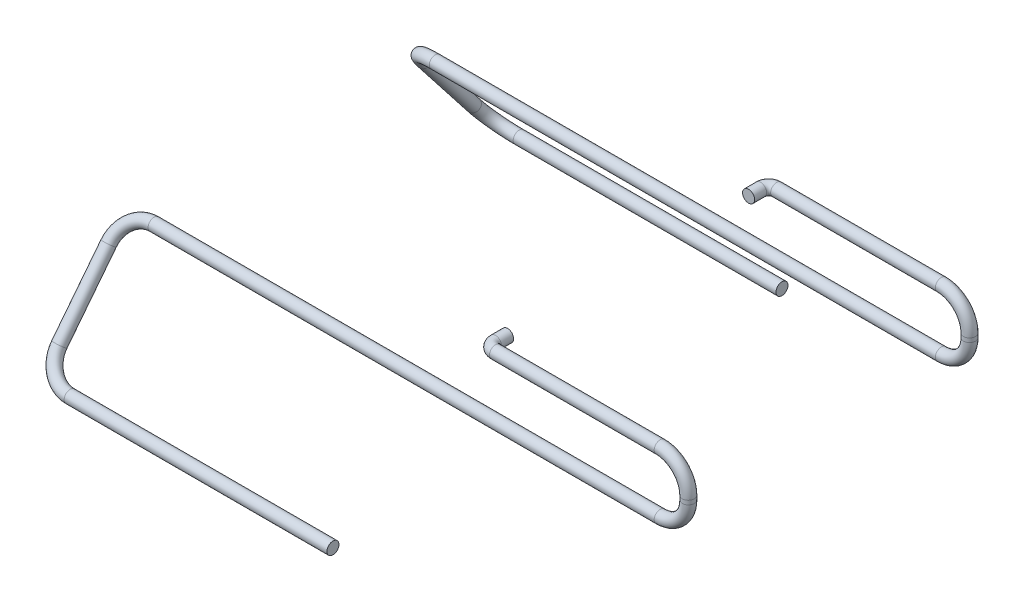
ISO-10303-21;
HEADER;
FILE_DESCRIPTION(('STEP AP214'),'2;1');
FILE_NAME('part.step','',(''),(''),'','','');
FILE_SCHEMA(('AUTOMOTIVE_DESIGN { 1 0 10303 214 1 1 1 1 }'));
ENDSEC;
DATA;
#1=APPLICATION_CONTEXT('core data for automotive mechanical design processes');
#2=APPLICATION_PROTOCOL_DEFINITION('international standard','automotive_design',2000,#1);
#3=PRODUCT_CONTEXT('',#1,'mechanical');
#4=PRODUCT('Part','Part','',(#3));
#5=PRODUCT_RELATED_PRODUCT_CATEGORY('part','',(#4));
#6=PRODUCT_DEFINITION_FORMATION('','',#4);
#7=PRODUCT_DEFINITION_CONTEXT('part definition',#1,'design');
#8=PRODUCT_DEFINITION('design','',#6,#7);
#9=PRODUCT_DEFINITION_SHAPE('','',#8);
#10=(LENGTH_UNIT() NAMED_UNIT(*) SI_UNIT(.MILLI.,.METRE.));
#11=(NAMED_UNIT(*) PLANE_ANGLE_UNIT() SI_UNIT($,.RADIAN.));
#12=(NAMED_UNIT(*) SI_UNIT($,.STERADIAN.) SOLID_ANGLE_UNIT());
#13=UNCERTAINTY_MEASURE_WITH_UNIT(LENGTH_MEASURE(1.E-05),#10,'distance_accuracy_value','');
#14=(GEOMETRIC_REPRESENTATION_CONTEXT(3) GLOBAL_UNCERTAINTY_ASSIGNED_CONTEXT((#13)) GLOBAL_UNIT_ASSIGNED_CONTEXT((#10,
#11,#12)) REPRESENTATION_CONTEXT('',''));
#15=CARTESIAN_POINT('',(0.,0.,0.));
#16=DIRECTION('',(0.,0.,1.));
#17=DIRECTION('',(1.,0.,0.));
#18=AXIS2_PLACEMENT_3D('',#15,#16,#17);
#19=CARTESIAN_POINT('',(-270.,0.,-650.));
#20=DIRECTION('',(1.,0.,0.));
#21=DIRECTION('',(0.,1.,0.));
#22=AXIS2_PLACEMENT_3D('',#19,#20,#21);
#23=CYLINDRICAL_SURFACE('',#22,15.0000000000001);
#24=CARTESIAN_POINT('',(-40.,0.,-650.));
#25=DIRECTION('',(1.,0.,0.));
#26=DIRECTION('',(0.,0.,1.));
#27=AXIS2_PLACEMENT_3D('',#24,#25,#26);
#28=CIRCLE('',#27,15.0000000000001);
#29=CARTESIAN_POINT('',(-40.,15.0000000000002,-650.));
#30=VERTEX_POINT('',#29);
#31=EDGE_CURVE('E58',#30,#30,#28,.T.);
#32=ORIENTED_EDGE('',*,*,#31,.F.);
#33=EDGE_LOOP('',(#32));
#34=FACE_BOUND('',#33,.T.);
#35=CARTESIAN_POINT('',(-450.,0.,-650.));
#36=DIRECTION('',(-1.,0.,0.));
#37=DIRECTION('',(0.,0.,1.));
#38=AXIS2_PLACEMENT_3D('',#35,#36,#37);
#39=CIRCLE('',#38,15.0000000000001);
#40=CARTESIAN_POINT('',(-450.,0.,-665.000000000001));
#41=VERTEX_POINT('',#40);
#42=EDGE_CURVE('E84',#41,#41,#39,.T.);
#43=ORIENTED_EDGE('',*,*,#42,.F.);
#44=EDGE_LOOP('',(#43));
#45=FACE_BOUND('',#44,.T.);
#46=ADVANCED_FACE('F43',(#34,#45),#23,.T.);
#47=CARTESIAN_POINT('',(-40.,-70.,-650.));
#48=DIRECTION('',(0.,0.,-1.));
#49=DIRECTION('',(-1.,0.,0.));
#50=AXIS2_PLACEMENT_3D('',#47,#48,#49);
#51=TOROIDAL_SURFACE('',#50,70.,15.0000000000001);
#52=CARTESIAN_POINT('',(29.9999999999999,-70.,-650.));
#53=DIRECTION('',(0.,-1.,0.));
#54=DIRECTION('',(0.,0.,1.));
#55=AXIS2_PLACEMENT_3D('',#52,#53,#54);
#56=CIRCLE('',#55,15.0000000000001);
#57=CARTESIAN_POINT('',(45.0000000000001,-70.,-650.));
#58=VERTEX_POINT('',#57);
#59=EDGE_CURVE('E54',#58,#58,#56,.T.);
#60=CARTESIAN_POINT('',(-40.,-70.,-650.));
#61=DIRECTION('',(0.,0.,-1.));
#62=DIRECTION('',(-1.,0.,0.));
#63=AXIS2_PLACEMENT_3D('',#60,#61,#62);
#64=CIRCLE('',#63,85.0000000000001);
#65=EDGE_CURVE('',#30,#58,#64,.T.);
#66=ORIENTED_EDGE('',*,*,#31,.T.);
#67=ORIENTED_EDGE('',*,*,#59,.F.);
#68=ORIENTED_EDGE('',*,*,#65,.T.);
#69=ORIENTED_EDGE('',*,*,#65,.F.);
#70=EDGE_LOOP('',(#66,#68,#67,#69));
#71=FACE_BOUND('',#70,.T.);
#72=ADVANCED_FACE('F91',(#71),#51,.T.);
#73=CARTESIAN_POINT('',(30.,-70.,-650.));
#74=DIRECTION('',(0.,-1.,0.));
#75=DIRECTION('',(1.,0.,0.));
#76=AXIS2_PLACEMENT_3D('',#73,#74,#75);
#77=CYLINDRICAL_SURFACE('',#76,15.0000000000001);
#78=CARTESIAN_POINT('',(30.,-80.,-650.));
#79=DIRECTION('',(0.,-1.,0.));
#80=DIRECTION('',(0.,0.,1.));
#81=AXIS2_PLACEMENT_3D('',#78,#79,#80);
#82=CIRCLE('',#81,15.0000000000001);
#83=CARTESIAN_POINT('',(45.0000000000001,-80.,-650.));
#84=VERTEX_POINT('',#83);
#85=EDGE_CURVE('E50',#84,#84,#82,.T.);
#86=ORIENTED_EDGE('',*,*,#85,.F.);
#87=EDGE_LOOP('',(#86));
#88=FACE_BOUND('',#87,.T.);
#89=ORIENTED_EDGE('',*,*,#59,.T.);
#90=EDGE_LOOP('',(#89));
#91=FACE_BOUND('',#90,.T.);
#92=ADVANCED_FACE('F98',(#88,#91),#77,.T.);
#93=CARTESIAN_POINT('',(-40.,-80.,-650.));
#94=DIRECTION('',(0.,0.,-1.));
#95=DIRECTION('',(-1.,0.,0.));
#96=AXIS2_PLACEMENT_3D('',#93,#94,#95);
#97=TOROIDAL_SURFACE('',#96,70.,15.0000000000001);
#98=CARTESIAN_POINT('',(-40.,-150.,-650.));
#99=DIRECTION('',(-1.,0.,0.));
#100=DIRECTION('',(0.,0.,1.));
#101=AXIS2_PLACEMENT_3D('',#98,#99,#100);
#102=CIRCLE('',#101,15.0000000000001);
#103=CARTESIAN_POINT('',(-40.,-165.,-650.));
#104=VERTEX_POINT('',#103);
#105=EDGE_CURVE('E12',#104,#104,#102,.T.);
#106=CARTESIAN_POINT('',(-40.,-80.,-650.));
#107=DIRECTION('',(0.,0.,-1.));
#108=DIRECTION('',(-1.,0.,0.));
#109=AXIS2_PLACEMENT_3D('',#106,#107,#108);
#110=CIRCLE('',#109,85.0000000000001);
#111=EDGE_CURVE('',#84,#104,#110,.T.);
#112=ORIENTED_EDGE('',*,*,#85,.T.);
#113=ORIENTED_EDGE('',*,*,#105,.F.);
#114=ORIENTED_EDGE('',*,*,#111,.T.);
#115=ORIENTED_EDGE('',*,*,#111,.F.);
#116=EDGE_LOOP('',(#112,#114,#113,#115));
#117=FACE_BOUND('',#116,.T.);
#118=ADVANCED_FACE('F109',(#117),#97,.T.);
#119=CARTESIAN_POINT('',(-40.,-150.,-650.));
#120=DIRECTION('',(-1.,0.,0.));
#121=DIRECTION('',(0.,-1.,0.));
#122=AXIS2_PLACEMENT_3D('',#119,#120,#121);
#123=CYLINDRICAL_SURFACE('',#122,15.0000000000001);
#124=ORIENTED_EDGE('',*,*,#105,.T.);
#125=EDGE_LOOP('',(#124));
#126=FACE_BOUND('',#125,.T.);
#127=CARTESIAN_POINT('',(-1300.,-150.,-650.));
#128=DIRECTION('',(-1.,0.,0.));
#129=DIRECTION('',(0.,-1.,0.));
#130=AXIS2_PLACEMENT_3D('',#127,#128,#129);
#131=CIRCLE('',#130,15.0000000000001);
#132=CARTESIAN_POINT('',(-1300.,-138.191801583891,-640.749786479988));
#133=VERTEX_POINT('',#132);
#134=EDGE_CURVE('E63',#133,#133,#131,.T.);
#135=ORIENTED_EDGE('',*,*,#134,.F.);
#136=EDGE_LOOP('',(#135));
#137=FACE_BOUND('',#136,.T.);
#138=ADVANCED_FACE('F45',(#126,#137),#123,.T.);
#139=CARTESIAN_POINT('',(-1120.,-416.8,-859.00368372643));
#140=DIRECTION('',(-1.,0.,0.));
#141=DIRECTION('',(0.,-1.,0.));
#142=AXIS2_PLACEMENT_3D('',#139,#140,#141);
#143=CYLINDRICAL_SURFACE('',#142,15.0000000000001);
#144=CARTESIAN_POINT('',(-1300.,-416.8,-859.00368372643));
#145=DIRECTION('',(1.,0.,0.));
#146=DIRECTION('',(0.,0.239409331859415,0.970918725650416));
#147=AXIS2_PLACEMENT_3D('',#144,#145,#146);
#148=CIRCLE('',#147,15.0000000000001);
#149=CARTESIAN_POINT('',(-1300.,-428.608198416109,-868.253897246443));
#150=VERTEX_POINT('',#149);
#151=EDGE_CURVE('E72',#150,#150,#148,.T.);
#152=ORIENTED_EDGE('',*,*,#151,.T.);
#153=EDGE_LOOP('',(#152));
#154=FACE_BOUND('',#153,.T.);
#155=CARTESIAN_POINT('',(-645.8,-416.8,-859.00368372643));
#156=DIRECTION('',(-1.,0.,0.));
#157=DIRECTION('',(0.,0.,-1.));
#158=AXIS2_PLACEMENT_3D('',#155,#156,#157);
#159=CIRCLE('',#158,15.);
#160=CARTESIAN_POINT('',(-645.8,-416.8,-874.00368372643));
#161=VERTEX_POINT('',#160);
#162=EDGE_CURVE('E75',#161,#161,#159,.T.);
#163=ORIENTED_EDGE('',*,*,#162,.T.);
#164=EDGE_LOOP('',(#163));
#165=FACE_BOUND('',#164,.T.);
#166=ADVANCED_FACE('F108',(#154,#165),#143,.T.);
#167=CARTESIAN_POINT('',(-1300.,-361.695074058161,-815.83602063304));
#168=DIRECTION('',(0.,0.616680901334144,-0.787213227740558));
#169=DIRECTION('',(0.,0.787213227740558,0.616680901334144));
#170=AXIS2_PLACEMENT_3D('',#167,#168,#169);
#171=TOROIDAL_SURFACE('',#170,70.0000000000002,15.0000000000001);
#172=CARTESIAN_POINT('',(-1370.,-361.695074058161,-815.83602063304));
#173=DIRECTION('',(0.,-0.787213227740558,-0.616680901334144));
#174=DIRECTION('',(0.787213227740558,-0.380295334070298,0.485459362825204));
#175=AXIS2_PLACEMENT_3D('',#172,#173,#174);
#176=CIRCLE('',#175,15.0000000000001);
#177=CARTESIAN_POINT('',(-1385.,-361.695074058161,-815.83602063304));
#178=VERTEX_POINT('',#177);
#179=EDGE_CURVE('E69',#178,#178,#176,.T.);
#180=CARTESIAN_POINT('',(-1300.,-361.695074058161,-815.83602063304));
#181=DIRECTION('',(0.,0.616680901334144,-0.787213227740558));
#182=DIRECTION('',(0.,0.787213227740558,0.616680901334144));
#183=AXIS2_PLACEMENT_3D('',#180,#181,#182);
#184=CIRCLE('',#183,85.0000000000003);
#185=EDGE_CURVE('',#150,#178,#184,.T.);
#186=ORIENTED_EDGE('',*,*,#151,.F.);
#187=ORIENTED_EDGE('',*,*,#179,.T.);
#188=ORIENTED_EDGE('',*,*,#185,.T.);
#189=ORIENTED_EDGE('',*,*,#185,.F.);
#190=EDGE_LOOP('',(#186,#188,#187,#189));
#191=FACE_BOUND('',#190,.T.);
#192=ADVANCED_FACE('F114',(#191),#171,.T.);
#193=CARTESIAN_POINT('',(-1370.,-361.695074058161,-815.83602063304));
#194=DIRECTION('',(0.,0.787213227740558,0.616680901334144));
#195=DIRECTION('',(0.,-0.616680901334144,0.787213227740558));
#196=AXIS2_PLACEMENT_3D('',#193,#194,#195);
#197=CYLINDRICAL_SURFACE('',#196,15.0000000000001);
#198=CARTESIAN_POINT('',(-1370.,-205.10492594184,-693.167663093391));
#199=DIRECTION('',(0.,-0.787213227740558,-0.616680901334144));
#200=DIRECTION('',(0.787213227740558,-0.380295334070292,0.485459362825208));
#201=AXIS2_PLACEMENT_3D('',#198,#199,#200);
#202=CIRCLE('',#201,15.0000000000001);
#203=CARTESIAN_POINT('',(-1385.,-205.10492594184,-693.167663093391));
#204=VERTEX_POINT('',#203);
#205=EDGE_CURVE('E66',#204,#204,#202,.T.);
#206=ORIENTED_EDGE('',*,*,#205,.T.);
#207=EDGE_LOOP('',(#206));
#208=FACE_BOUND('',#207,.T.);
#209=ORIENTED_EDGE('',*,*,#179,.F.);
#210=EDGE_LOOP('',(#209));
#211=FACE_BOUND('',#210,.T.);
#212=ADVANCED_FACE('F105',(#208,#211),#197,.T.);
#213=CARTESIAN_POINT('',(-1300.,-205.104925941839,-693.167663093391));
#214=DIRECTION('',(0.,0.616680901334144,-0.787213227740558));
#215=DIRECTION('',(0.,0.787213227740558,0.616680901334144));
#216=AXIS2_PLACEMENT_3D('',#213,#214,#215);
#217=TOROIDAL_SURFACE('',#216,70.0000000000001,15.0000000000001);
#218=CARTESIAN_POINT('',(-1300.,-205.104925941839,-693.167663093391));
#219=DIRECTION('',(0.,0.616680901334144,-0.787213227740558));
#220=DIRECTION('',(0.,0.787213227740558,0.616680901334144));
#221=AXIS2_PLACEMENT_3D('',#218,#219,#220);
#222=CIRCLE('',#221,85.0000000000002);
#223=EDGE_CURVE('',#204,#133,#222,.T.);
#224=ORIENTED_EDGE('',*,*,#205,.F.);
#225=ORIENTED_EDGE('',*,*,#134,.T.);
#226=ORIENTED_EDGE('',*,*,#223,.T.);
#227=ORIENTED_EDGE('',*,*,#223,.F.);
#228=EDGE_LOOP('',(#224,#226,#225,#227));
#229=FACE_BOUND('',#228,.T.);
#230=ADVANCED_FACE('F94',(#229),#217,.T.);
#231=CARTESIAN_POINT('',(-645.8,-416.8,-859.00368372643));
#232=DIRECTION('',(1.,0.,0.));
#233=DIRECTION('',(0.,0.,-1.));
#234=AXIS2_PLACEMENT_3D('',#231,#232,#233);
#235=PLANE('',#234);
#236=ORIENTED_EDGE('',*,*,#162,.F.);
#237=EDGE_LOOP('',(#236));
#238=FACE_BOUND('',#237,.T.);
#239=ADVANCED_FACE('F104',(#238),#235,.T.);
#240=CARTESIAN_POINT('',(-470.,0.,-600.));
#241=DIRECTION('',(0.,0.,1.));
#242=DIRECTION('',(1.,0.,0.));
#243=AXIS2_PLACEMENT_3D('',#240,#241,#242);
#244=PLANE('',#243);
#245=CARTESIAN_POINT('',(-470.,0.,-600.));
#246=DIRECTION('',(0.,0.,1.));
#247=DIRECTION('',(1.,0.,0.));
#248=AXIS2_PLACEMENT_3D('',#245,#246,#247);
#249=CIRCLE('',#248,15.0000000000001);
#250=CARTESIAN_POINT('',(-455.,0.,-600.));
#251=VERTEX_POINT('',#250);
#252=EDGE_CURVE('E78',#251,#251,#249,.T.);
#253=ORIENTED_EDGE('',*,*,#252,.T.);
#254=EDGE_LOOP('',(#253));
#255=FACE_BOUND('',#254,.T.);
#256=ADVANCED_FACE('F136',(#255),#244,.T.);
#257=CARTESIAN_POINT('',(-450.,0.,-630.));
#258=DIRECTION('',(0.,1.,0.));
#259=DIRECTION('',(-1.,0.,0.));
#260=AXIS2_PLACEMENT_3D('',#257,#258,#259);
#261=TOROIDAL_SURFACE('',#260,20.0000000000004,15.0000000000001);
#262=CARTESIAN_POINT('',(-470.,0.,-630.000000000001));
#263=DIRECTION('',(0.,0.,1.));
#264=DIRECTION('',(1.,0.,0.));
#265=AXIS2_PLACEMENT_3D('',#262,#263,#264);
#266=CIRCLE('',#265,15.0000000000001);
#267=CARTESIAN_POINT('',(-485.,0.,-630.000000000001));
#268=VERTEX_POINT('',#267);
#269=EDGE_CURVE('E81',#268,#268,#266,.T.);
#270=CARTESIAN_POINT('',(-450.,0.,-630.));
#271=DIRECTION('',(0.,1.,0.));
#272=DIRECTION('',(-1.,0.,0.));
#273=AXIS2_PLACEMENT_3D('',#270,#271,#272);
#274=CIRCLE('',#273,35.0000000000005);
#275=EDGE_CURVE('',#41,#268,#274,.T.);
#276=ORIENTED_EDGE('',*,*,#42,.T.);
#277=ORIENTED_EDGE('',*,*,#269,.F.);
#278=ORIENTED_EDGE('',*,*,#275,.T.);
#279=ORIENTED_EDGE('',*,*,#275,.F.);
#280=EDGE_LOOP('',(#276,#278,#277,#279));
#281=FACE_BOUND('',#280,.T.);
#282=ADVANCED_FACE('F88',(#281),#261,.T.);
#283=CARTESIAN_POINT('',(-470.,0.,-630.000000000001));
#284=DIRECTION('',(0.,0.,1.));
#285=DIRECTION('',(1.,0.,0.));
#286=AXIS2_PLACEMENT_3D('',#283,#284,#285);
#287=CYLINDRICAL_SURFACE('',#286,15.0000000000001);
#288=ORIENTED_EDGE('',*,*,#252,.F.);
#289=EDGE_LOOP('',(#288));
#290=FACE_BOUND('',#289,.T.);
#291=ORIENTED_EDGE('',*,*,#269,.T.);
#292=EDGE_LOOP('',(#291));
#293=FACE_BOUND('',#292,.T.);
#294=ADVANCED_FACE('F138',(#290,#293),#287,.T.);
#295=CLOSED_SHELL('',(#46,#72,#92,#118,#138,#166,#192,#212,#230,#239,#256,#282,#294));
#296=MANIFOLD_SOLID_BREP('B2',#295);
#297=CARTESIAN_POINT('',(-270.,0.,50.));
#298=DIRECTION('',(1.,0.,0.));
#299=DIRECTION('',(0.,1.,0.));
#300=AXIS2_PLACEMENT_3D('',#297,#298,#299);
#301=CYLINDRICAL_SURFACE('',#300,15.);
#302=CARTESIAN_POINT('',(-40.,0.,50.));
#303=DIRECTION('',(1.,0.,0.));
#304=DIRECTION('',(0.,0.,-1.));
#305=AXIS2_PLACEMENT_3D('',#302,#303,#304);
#306=CIRCLE('',#305,15.);
#307=CARTESIAN_POINT('',(-40.,15.,50.));
#308=VERTEX_POINT('',#307);
#309=EDGE_CURVE('E257',#308,#308,#306,.T.);
#310=ORIENTED_EDGE('',*,*,#309,.F.);
#311=EDGE_LOOP('',(#310));
#312=FACE_BOUND('',#311,.T.);
#313=CARTESIAN_POINT('',(-450.,0.,50.));
#314=DIRECTION('',(-1.,0.,0.));
#315=DIRECTION('',(0.,0.,1.));
#316=AXIS2_PLACEMENT_3D('',#313,#314,#315);
#317=CIRCLE('',#316,14.9999999999999);
#318=CARTESIAN_POINT('',(-450.,0.,64.9999999999999));
#319=VERTEX_POINT('',#318);
#320=EDGE_CURVE('E283',#319,#319,#317,.T.);
#321=ORIENTED_EDGE('',*,*,#320,.F.);
#322=EDGE_LOOP('',(#321));
#323=FACE_BOUND('',#322,.T.);
#324=ADVANCED_FACE('F242',(#312,#323),#301,.T.);
#325=CARTESIAN_POINT('',(-40.,-70.,50.));
#326=DIRECTION('',(0.,0.,-1.));
#327=DIRECTION('',(-1.,0.,0.));
#328=AXIS2_PLACEMENT_3D('',#325,#326,#327);
#329=TOROIDAL_SURFACE('',#328,70.,15.);
#330=CARTESIAN_POINT('',(29.9999999999999,-70.,50.));
#331=DIRECTION('',(0.,-1.,0.));
#332=DIRECTION('',(0.,0.,-1.));
#333=AXIS2_PLACEMENT_3D('',#330,#331,#332);
#334=CIRCLE('',#333,15.);
#335=CARTESIAN_POINT('',(45.,-70.,50.));
#336=VERTEX_POINT('',#335);
#337=EDGE_CURVE('E253',#336,#336,#334,.T.);
#338=CARTESIAN_POINT('',(-40.,-70.,50.));
#339=DIRECTION('',(0.,0.,-1.));
#340=DIRECTION('',(-1.,0.,0.));
#341=AXIS2_PLACEMENT_3D('',#338,#339,#340);
#342=CIRCLE('',#341,85.);
#343=EDGE_CURVE('',#308,#336,#342,.T.);
#344=ORIENTED_EDGE('',*,*,#309,.T.);
#345=ORIENTED_EDGE('',*,*,#337,.F.);
#346=ORIENTED_EDGE('',*,*,#343,.T.);
#347=ORIENTED_EDGE('',*,*,#343,.F.);
#348=EDGE_LOOP('',(#344,#346,#345,#347));
#349=FACE_BOUND('',#348,.T.);
#350=ADVANCED_FACE('F290',(#349),#329,.T.);
#351=CARTESIAN_POINT('',(30.,-70.,50.));
#352=DIRECTION('',(0.,-1.,0.));
#353=DIRECTION('',(1.,0.,0.));
#354=AXIS2_PLACEMENT_3D('',#351,#352,#353);
#355=CYLINDRICAL_SURFACE('',#354,15.);
#356=CARTESIAN_POINT('',(30.,-80.,50.));
#357=DIRECTION('',(0.,-1.,0.));
#358=DIRECTION('',(0.,0.,-1.));
#359=AXIS2_PLACEMENT_3D('',#356,#357,#358);
#360=CIRCLE('',#359,15.);
#361=CARTESIAN_POINT('',(45.,-80.,50.));
#362=VERTEX_POINT('',#361);
#363=EDGE_CURVE('E249',#362,#362,#360,.T.);
#364=ORIENTED_EDGE('',*,*,#363,.F.);
#365=EDGE_LOOP('',(#364));
#366=FACE_BOUND('',#365,.T.);
#367=ORIENTED_EDGE('',*,*,#337,.T.);
#368=EDGE_LOOP('',(#367));
#369=FACE_BOUND('',#368,.T.);
#370=ADVANCED_FACE('F297',(#366,#369),#355,.T.);
#371=CARTESIAN_POINT('',(-40.,-80.,50.));
#372=DIRECTION('',(0.,0.,-1.));
#373=DIRECTION('',(-1.,0.,0.));
#374=AXIS2_PLACEMENT_3D('',#371,#372,#373);
#375=TOROIDAL_SURFACE('',#374,70.,15.);
#376=CARTESIAN_POINT('',(-40.,-150.,50.));
#377=DIRECTION('',(-1.,0.,0.));
#378=DIRECTION('',(0.,0.,-1.));
#379=AXIS2_PLACEMENT_3D('',#376,#377,#378);
#380=CIRCLE('',#379,15.);
#381=CARTESIAN_POINT('',(-40.,-165.,50.));
#382=VERTEX_POINT('',#381);
#383=EDGE_CURVE('E42',#382,#382,#380,.T.);
#384=CARTESIAN_POINT('',(-40.,-80.,50.));
#385=DIRECTION('',(0.,0.,-1.));
#386=DIRECTION('',(-1.,0.,0.));
#387=AXIS2_PLACEMENT_3D('',#384,#385,#386);
#388=CIRCLE('',#387,85.);
#389=EDGE_CURVE('',#362,#382,#388,.T.);
#390=ORIENTED_EDGE('',*,*,#363,.T.);
#391=ORIENTED_EDGE('',*,*,#383,.F.);
#392=ORIENTED_EDGE('',*,*,#389,.T.);
#393=ORIENTED_EDGE('',*,*,#389,.F.);
#394=EDGE_LOOP('',(#390,#392,#391,#393));
#395=FACE_BOUND('',#394,.T.);
#396=ADVANCED_FACE('F308',(#395),#375,.T.);
#397=CARTESIAN_POINT('',(-40.,-150.,50.));
#398=DIRECTION('',(-1.,0.,0.));
#399=DIRECTION('',(0.,-1.,0.));
#400=AXIS2_PLACEMENT_3D('',#397,#398,#399);
#401=CYLINDRICAL_SURFACE('',#400,15.);
#402=ORIENTED_EDGE('',*,*,#383,.T.);
#403=EDGE_LOOP('',(#402));
#404=FACE_BOUND('',#403,.T.);
#405=CARTESIAN_POINT('',(-1300.,-150.,49.9999999999999));
#406=DIRECTION('',(-1.,0.,0.));
#407=DIRECTION('',(0.,-1.,0.));
#408=AXIS2_PLACEMENT_3D('',#405,#406,#407);
#409=CIRCLE('',#408,15.);
#410=CARTESIAN_POINT('',(-1300.,-138.191801583892,40.7497864799877));
#411=VERTEX_POINT('',#410);
#412=EDGE_CURVE('E262',#411,#411,#409,.T.);
#413=ORIENTED_EDGE('',*,*,#412,.F.);
#414=EDGE_LOOP('',(#413));
#415=FACE_BOUND('',#414,.T.);
#416=ADVANCED_FACE('F244',(#404,#415),#401,.T.);
#417=CARTESIAN_POINT('',(-1120.,-416.8,259.00368372643));
#418=DIRECTION('',(-1.,0.,0.));
#419=DIRECTION('',(0.,-1.,0.));
#420=AXIS2_PLACEMENT_3D('',#417,#418,#419);
#421=CYLINDRICAL_SURFACE('',#420,15.);
#422=CARTESIAN_POINT('',(-1300.,-416.8,259.00368372643));
#423=DIRECTION('',(1.,0.,0.));
#424=DIRECTION('',(0.,0.239409331859416,-0.970918725650416));
#425=AXIS2_PLACEMENT_3D('',#422,#423,#424);
#426=CIRCLE('',#425,15.);
#427=CARTESIAN_POINT('',(-1300.,-428.608198416108,268.253897246442));
#428=VERTEX_POINT('',#427);
#429=EDGE_CURVE('E271',#428,#428,#426,.T.);
#430=ORIENTED_EDGE('',*,*,#429,.T.);
#431=EDGE_LOOP('',(#430));
#432=FACE_BOUND('',#431,.T.);
#433=CARTESIAN_POINT('',(-645.8,-416.8,259.00368372643));
#434=DIRECTION('',(-1.,0.,0.));
#435=DIRECTION('',(0.,0.,1.));
#436=AXIS2_PLACEMENT_3D('',#433,#434,#435);
#437=CIRCLE('',#436,15.);
#438=CARTESIAN_POINT('',(-645.8,-416.8,274.00368372643));
#439=VERTEX_POINT('',#438);
#440=EDGE_CURVE('E274',#439,#439,#437,.T.);
#441=ORIENTED_EDGE('',*,*,#440,.T.);
#442=EDGE_LOOP('',(#441));
#443=FACE_BOUND('',#442,.T.);
#444=ADVANCED_FACE('F307',(#432,#443),#421,.T.);
#445=CARTESIAN_POINT('',(-1300.,-361.695074058161,215.83602063304));
#446=DIRECTION('',(0.,-0.616680901334144,-0.787213227740558));
#447=DIRECTION('',(0.,0.787213227740558,-0.616680901334144));
#448=AXIS2_PLACEMENT_3D('',#445,#446,#447);
#449=TOROIDAL_SURFACE('',#448,70.0000000000001,15.);
#450=CARTESIAN_POINT('',(-1370.,-361.695074058161,215.836020633039));
#451=DIRECTION('',(0.,-0.787213227740558,0.616680901334144));
#452=DIRECTION('',(0.787213227740558,-0.380295334070296,-0.485459362825205));
#453=AXIS2_PLACEMENT_3D('',#450,#451,#452);
#454=CIRCLE('',#453,15.);
#455=CARTESIAN_POINT('',(-1385.,-361.695074058161,215.836020633039));
#456=VERTEX_POINT('',#455);
#457=EDGE_CURVE('E268',#456,#456,#454,.T.);
#458=CARTESIAN_POINT('',(-1300.,-361.695074058161,215.83602063304));
#459=DIRECTION('',(0.,-0.616680901334144,-0.787213227740558));
#460=DIRECTION('',(0.,0.787213227740558,-0.616680901334144));
#461=AXIS2_PLACEMENT_3D('',#458,#459,#460);
#462=CIRCLE('',#461,85.0000000000001);
#463=EDGE_CURVE('',#428,#456,#462,.T.);
#464=ORIENTED_EDGE('',*,*,#429,.F.);
#465=ORIENTED_EDGE('',*,*,#457,.T.);
#466=ORIENTED_EDGE('',*,*,#463,.T.);
#467=ORIENTED_EDGE('',*,*,#463,.F.);
#468=EDGE_LOOP('',(#464,#466,#465,#467));
#469=FACE_BOUND('',#468,.T.);
#470=ADVANCED_FACE('F313',(#469),#449,.T.);
#471=CARTESIAN_POINT('',(-1370.,-361.695074058161,215.836020633039));
#472=DIRECTION('',(0.,0.787213227740558,-0.616680901334144));
#473=DIRECTION('',(0.,0.616680901334144,0.787213227740558));
#474=AXIS2_PLACEMENT_3D('',#471,#472,#473);
#475=CYLINDRICAL_SURFACE('',#474,15.);
#476=CARTESIAN_POINT('',(-1370.,-205.10492594184,93.1676630933904));
#477=DIRECTION('',(0.,-0.787213227740558,0.616680901334144));
#478=DIRECTION('',(0.787213227740558,-0.380295334070292,-0.485459362825208));
#479=AXIS2_PLACEMENT_3D('',#476,#477,#478);
#480=CIRCLE('',#479,15.);
#481=CARTESIAN_POINT('',(-1385.,-205.10492594184,93.1676630933905));
#482=VERTEX_POINT('',#481);
#483=EDGE_CURVE('E265',#482,#482,#480,.T.);
#484=ORIENTED_EDGE('',*,*,#483,.T.);
#485=EDGE_LOOP('',(#484));
#486=FACE_BOUND('',#485,.T.);
#487=ORIENTED_EDGE('',*,*,#457,.F.);
#488=EDGE_LOOP('',(#487));
#489=FACE_BOUND('',#488,.T.);
#490=ADVANCED_FACE('F304',(#486,#489),#475,.T.);
#491=CARTESIAN_POINT('',(-1300.,-205.104925941839,93.16766309339));
#492=DIRECTION('',(0.,-0.616680901334144,-0.787213227740558));
#493=DIRECTION('',(0.,0.787213227740558,-0.616680901334144));
#494=AXIS2_PLACEMENT_3D('',#491,#492,#493);
#495=TOROIDAL_SURFACE('',#494,70.0000000000001,15.);
#496=CARTESIAN_POINT('',(-1300.,-205.104925941839,93.16766309339));
#497=DIRECTION('',(0.,-0.616680901334144,-0.787213227740558));
#498=DIRECTION('',(0.,0.787213227740558,-0.616680901334144));
#499=AXIS2_PLACEMENT_3D('',#496,#497,#498);
#500=CIRCLE('',#499,85.0000000000001);
#501=EDGE_CURVE('',#482,#411,#500,.T.);
#502=ORIENTED_EDGE('',*,*,#483,.F.);
#503=ORIENTED_EDGE('',*,*,#412,.T.);
#504=ORIENTED_EDGE('',*,*,#501,.T.);
#505=ORIENTED_EDGE('',*,*,#501,.F.);
#506=EDGE_LOOP('',(#502,#504,#503,#505));
#507=FACE_BOUND('',#506,.T.);
#508=ADVANCED_FACE('F293',(#507),#495,.T.);
#509=CARTESIAN_POINT('',(-645.8,-416.8,259.00368372643));
#510=DIRECTION('',(-1.,0.,0.));
#511=DIRECTION('',(0.,0.,1.));
#512=AXIS2_PLACEMENT_3D('',#509,#510,#511);
#513=PLANE('',#512);
#514=ORIENTED_EDGE('',*,*,#440,.F.);
#515=EDGE_LOOP('',(#514));
#516=FACE_BOUND('',#515,.T.);
#517=ADVANCED_FACE('F303',(#516),#513,.F.);
#518=CARTESIAN_POINT('',(-470.,0.,-2.22044604925031E-13));
#519=DIRECTION('',(0.,0.,-1.));
#520=DIRECTION('',(-1.,0.,0.));
#521=AXIS2_PLACEMENT_3D('',#518,#519,#520);
#522=PLANE('',#521);
#523=CARTESIAN_POINT('',(-470.,0.,-2.22044604925031E-13));
#524=DIRECTION('',(0.,0.,-1.));
#525=DIRECTION('',(-1.,0.,0.));
#526=AXIS2_PLACEMENT_3D('',#523,#524,#525);
#527=CIRCLE('',#526,14.9999999999999);
#528=CARTESIAN_POINT('',(-485.,0.,-2.48065457064683E-13));
#529=VERTEX_POINT('',#528);
#530=EDGE_CURVE('E277',#529,#529,#527,.T.);
#531=ORIENTED_EDGE('',*,*,#530,.T.);
#532=EDGE_LOOP('',(#531));
#533=FACE_BOUND('',#532,.T.);
#534=ADVANCED_FACE('F335',(#533),#522,.T.);
#535=CARTESIAN_POINT('',(-450.,0.,30.));
#536=DIRECTION('',(0.,-1.,0.));
#537=DIRECTION('',(1.,0.,0.));
#538=AXIS2_PLACEMENT_3D('',#535,#536,#537);
#539=TOROIDAL_SURFACE('',#538,20.0000000000001,14.9999999999999);
#540=CARTESIAN_POINT('',(-470.,0.,30.));
#541=DIRECTION('',(0.,0.,-1.));
#542=DIRECTION('',(-1.,0.,0.));
#543=AXIS2_PLACEMENT_3D('',#540,#541,#542);
#544=CIRCLE('',#543,14.9999999999999);
#545=CARTESIAN_POINT('',(-485.,0.,30.));
#546=VERTEX_POINT('',#545);
#547=EDGE_CURVE('E280',#546,#546,#544,.T.);
#548=CARTESIAN_POINT('',(-450.,0.,30.));
#549=DIRECTION('',(0.,-1.,0.));
#550=DIRECTION('',(1.,0.,0.));
#551=AXIS2_PLACEMENT_3D('',#548,#549,#550);
#552=CIRCLE('',#551,35.);
#553=EDGE_CURVE('',#319,#546,#552,.T.);
#554=ORIENTED_EDGE('',*,*,#320,.T.);
#555=ORIENTED_EDGE('',*,*,#547,.F.);
#556=ORIENTED_EDGE('',*,*,#553,.T.);
#557=ORIENTED_EDGE('',*,*,#553,.F.);
#558=EDGE_LOOP('',(#554,#556,#555,#557));
#559=FACE_BOUND('',#558,.T.);
#560=ADVANCED_FACE('F287',(#559),#539,.T.);
#561=CARTESIAN_POINT('',(-470.,0.,30.));
#562=DIRECTION('',(0.,0.,-1.));
#563=DIRECTION('',(-1.,0.,0.));
#564=AXIS2_PLACEMENT_3D('',#561,#562,#563);
#565=CYLINDRICAL_SURFACE('',#564,14.9999999999999);
#566=ORIENTED_EDGE('',*,*,#530,.F.);
#567=EDGE_LOOP('',(#566));
#568=FACE_BOUND('',#567,.T.);
#569=ORIENTED_EDGE('',*,*,#547,.T.);
#570=EDGE_LOOP('',(#569));
#571=FACE_BOUND('',#570,.T.);
#572=ADVANCED_FACE('F337',(#568,#571),#565,.T.);
#573=CLOSED_SHELL('',(#324,#350,#370,#396,#416,#444,#470,#490,#508,#517,#534,#560,#572));
#574=MANIFOLD_SOLID_BREP('B7',#573);
#575=ADVANCED_BREP_SHAPE_REPRESENTATION('',(#18,#296,#574),#14);
#576=SHAPE_DEFINITION_REPRESENTATION(#9,#575);
ENDSEC;
END-ISO-10303-21;
